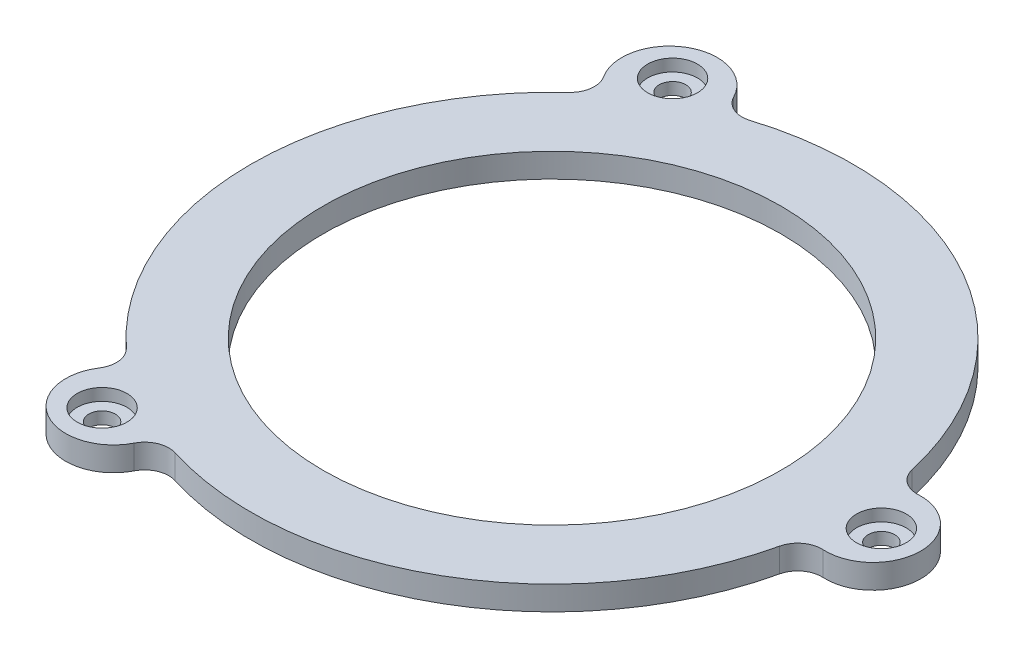
ISO-10303-21;
HEADER;
FILE_DESCRIPTION(('STEP AP214'),'2;1');
FILE_NAME('part.step','',(''),(''),'','','');
FILE_SCHEMA(('AUTOMOTIVE_DESIGN { 1 0 10303 214 1 1 1 1 }'));
ENDSEC;
DATA;
#1=APPLICATION_CONTEXT('core data for automotive mechanical design processes');
#2=APPLICATION_PROTOCOL_DEFINITION('international standard','automotive_design',2000,#1);
#3=PRODUCT_CONTEXT('',#1,'mechanical');
#4=PRODUCT('Part','Part','',(#3));
#5=PRODUCT_RELATED_PRODUCT_CATEGORY('part','',(#4));
#6=PRODUCT_DEFINITION_FORMATION('','',#4);
#7=PRODUCT_DEFINITION_CONTEXT('part definition',#1,'design');
#8=PRODUCT_DEFINITION('design','',#6,#7);
#9=PRODUCT_DEFINITION_SHAPE('','',#8);
#10=(LENGTH_UNIT() NAMED_UNIT(*) SI_UNIT(.MILLI.,.METRE.));
#11=(NAMED_UNIT(*) PLANE_ANGLE_UNIT() SI_UNIT($,.RADIAN.));
#12=(NAMED_UNIT(*) SI_UNIT($,.STERADIAN.) SOLID_ANGLE_UNIT());
#13=UNCERTAINTY_MEASURE_WITH_UNIT(LENGTH_MEASURE(1.E-05),#10,'distance_accuracy_value','');
#14=(GEOMETRIC_REPRESENTATION_CONTEXT(3) GLOBAL_UNCERTAINTY_ASSIGNED_CONTEXT((#13)) GLOBAL_UNIT_ASSIGNED_CONTEXT((#10,
#11,#12)) REPRESENTATION_CONTEXT('',''));
#15=CARTESIAN_POINT('',(0.,0.,0.));
#16=DIRECTION('',(0.,0.,1.));
#17=DIRECTION('',(1.,0.,0.));
#18=AXIS2_PLACEMENT_3D('',#15,#16,#17);
#19=CARTESIAN_POINT('',(-20.5,-7.,-35.507041555162));
#20=DIRECTION('',(0.,1.,0.));
#21=DIRECTION('',(0.,0.,1.));
#22=AXIS2_PLACEMENT_3D('',#19,#20,#21);
#23=CYLINDRICAL_SURFACE('',#22,1.64999999999999);
#24=CARTESIAN_POINT('',(-20.5,0.,-35.507041555162));
#25=DIRECTION('',(0.,1.,0.));
#26=DIRECTION('',(0.,0.,1.));
#27=AXIS2_PLACEMENT_3D('',#24,#25,#26);
#28=CIRCLE('',#27,1.64999999999999);
#29=CARTESIAN_POINT('',(-20.5,0.,-33.857041555162));
#30=VERTEX_POINT('',#29);
#31=EDGE_CURVE('E285',#30,#30,#28,.T.);
#32=ORIENTED_EDGE('',*,*,#31,.F.);
#33=EDGE_LOOP('',(#32));
#34=FACE_BOUND('',#33,.T.);
#35=CARTESIAN_POINT('',(-20.5,1.5,-35.507041555162));
#36=DIRECTION('',(0.,1.,0.));
#37=DIRECTION('',(0.,0.,1.));
#38=AXIS2_PLACEMENT_3D('',#35,#36,#37);
#39=CIRCLE('',#38,1.64999999999999);
#40=CARTESIAN_POINT('',(-20.5,1.5,-33.857041555162));
#41=VERTEX_POINT('',#40);
#42=EDGE_CURVE('E152',#41,#41,#39,.F.);
#43=ORIENTED_EDGE('',*,*,#42,.F.);
#44=EDGE_LOOP('',(#43));
#45=FACE_BOUND('',#44,.T.);
#46=ADVANCED_FACE('F32',(#34,#45),#23,.F.);
#47=CARTESIAN_POINT('',(-20.5,-7.,35.507041555162));
#48=DIRECTION('',(0.,1.,0.));
#49=DIRECTION('',(0.,0.,1.));
#50=AXIS2_PLACEMENT_3D('',#47,#48,#49);
#51=CYLINDRICAL_SURFACE('',#50,1.64999999999999);
#52=CARTESIAN_POINT('',(-20.5,0.,35.507041555162));
#53=DIRECTION('',(0.,1.,0.));
#54=DIRECTION('',(0.,0.,1.));
#55=AXIS2_PLACEMENT_3D('',#52,#53,#54);
#56=CIRCLE('',#55,1.64999999999999);
#57=CARTESIAN_POINT('',(-20.5,0.,37.157041555162));
#58=VERTEX_POINT('',#57);
#59=EDGE_CURVE('E288',#58,#58,#56,.T.);
#60=ORIENTED_EDGE('',*,*,#59,.F.);
#61=EDGE_LOOP('',(#60));
#62=FACE_BOUND('',#61,.T.);
#63=CARTESIAN_POINT('',(-20.5,1.5,35.507041555162));
#64=DIRECTION('',(0.,1.,0.));
#65=DIRECTION('',(0.,0.,1.));
#66=AXIS2_PLACEMENT_3D('',#63,#64,#65);
#67=CIRCLE('',#66,1.64999999999999);
#68=CARTESIAN_POINT('',(-20.5,1.5,37.157041555162));
#69=VERTEX_POINT('',#68);
#70=EDGE_CURVE('E297',#69,#69,#67,.F.);
#71=ORIENTED_EDGE('',*,*,#70,.F.);
#72=EDGE_LOOP('',(#71));
#73=FACE_BOUND('',#72,.T.);
#74=ADVANCED_FACE('F219',(#62,#73),#51,.F.);
#75=CARTESIAN_POINT('',(41.,-7.,0.));
#76=DIRECTION('',(0.,1.,0.));
#77=DIRECTION('',(0.,0.,1.));
#78=AXIS2_PLACEMENT_3D('',#75,#76,#77);
#79=CYLINDRICAL_SURFACE('',#78,1.65);
#80=CARTESIAN_POINT('',(41.,0.,0.));
#81=DIRECTION('',(0.,1.,0.));
#82=DIRECTION('',(0.,0.,1.));
#83=AXIS2_PLACEMENT_3D('',#80,#81,#82);
#84=CIRCLE('',#83,1.65);
#85=CARTESIAN_POINT('',(41.,0.,1.65));
#86=VERTEX_POINT('',#85);
#87=EDGE_CURVE('E291',#86,#86,#84,.T.);
#88=ORIENTED_EDGE('',*,*,#87,.F.);
#89=EDGE_LOOP('',(#88));
#90=FACE_BOUND('',#89,.T.);
#91=CARTESIAN_POINT('',(41.,1.5,0.));
#92=DIRECTION('',(0.,1.,0.));
#93=DIRECTION('',(0.,0.,1.));
#94=AXIS2_PLACEMENT_3D('',#91,#92,#93);
#95=CIRCLE('',#94,1.65);
#96=CARTESIAN_POINT('',(41.,1.5,1.65));
#97=VERTEX_POINT('',#96);
#98=EDGE_CURVE('E295',#97,#97,#95,.F.);
#99=ORIENTED_EDGE('',*,*,#98,.F.);
#100=EDGE_LOOP('',(#99));
#101=FACE_BOUND('',#100,.T.);
#102=ADVANCED_FACE('F225',(#90,#101),#79,.F.);
#103=CARTESIAN_POINT('',(0.,3.,0.));
#104=DIRECTION('',(0.,-1.,0.));
#105=DIRECTION('',(0.,0.,-1.));
#106=AXIS2_PLACEMENT_3D('',#103,#104,#105);
#107=CYLINDRICAL_SURFACE('',#106,37.5);
#108=CARTESIAN_POINT('',(0.,0.,0.));
#109=DIRECTION('',(0.,1.,0.));
#110=DIRECTION('',(0.,0.,1.));
#111=AXIS2_PLACEMENT_3D('',#108,#109,#110);
#112=CIRCLE('',#111,37.5);
#113=CARTESIAN_POINT('',(36.578160438466,0.,-8.26366619230459));
#114=VERTEX_POINT('',#113);
#115=CARTESIAN_POINT('',(-11.1325353683026,0.,-35.8094492595668));
#116=VERTEX_POINT('',#115);
#117=EDGE_CURVE('E143',#114,#116,#112,.T.);
#118=ORIENTED_EDGE('',*,*,#117,.T.);
#119=DIRECTION('',(0.,-1.,0.));
#120=VECTOR('',#119,1.);
#121=CARTESIAN_POINT('',(-11.1325353683026,3.,-35.8094492595668));
#122=LINE('',#121,#120);
#123=CARTESIAN_POINT('',(-11.1325353683026,3.,-35.8094492595668));
#124=VERTEX_POINT('',#123);
#125=EDGE_CURVE('E175',#116,#124,#122,.F.);
#126=ORIENTED_EDGE('',*,*,#125,.T.);
#127=CARTESIAN_POINT('',(0.,3.,0.));
#128=DIRECTION('',(0.,1.,0.));
#129=DIRECTION('',(0.,0.,1.));
#130=AXIS2_PLACEMENT_3D('',#127,#128,#129);
#131=CIRCLE('',#130,37.5);
#132=CARTESIAN_POINT('',(36.578160438466,3.,-8.26366619230459));
#133=VERTEX_POINT('',#132);
#134=EDGE_CURVE('E145',#133,#124,#131,.T.);
#135=ORIENTED_EDGE('',*,*,#134,.F.);
#136=DIRECTION('',(0.,-1.,0.));
#137=VECTOR('',#136,1.);
#138=CARTESIAN_POINT('',(36.578160438466,3.,-8.26366619230459));
#139=LINE('',#138,#137);
#140=EDGE_CURVE('E173',#133,#114,#139,.T.);
#141=ORIENTED_EDGE('',*,*,#140,.T.);
#142=EDGE_LOOP('',(#118,#126,#135,#141));
#143=FACE_BOUND('',#142,.T.);
#144=ADVANCED_FACE('F202',(#143),#107,.T.);
#145=CARTESIAN_POINT('',(-25.4456250701634,0.,-27.5457830672622));
#146=VERTEX_POINT('',#145);
#147=CARTESIAN_POINT('',(-25.4456250701634,0.,27.5457830672623));
#148=VERTEX_POINT('',#147);
#149=EDGE_CURVE('E204',#146,#148,#112,.T.);
#150=ORIENTED_EDGE('',*,*,#149,.T.);
#151=DIRECTION('',(0.,-1.,0.));
#152=VECTOR('',#151,1.);
#153=CARTESIAN_POINT('',(-25.4456250701634,3.,27.5457830672623));
#154=LINE('',#153,#152);
#155=CARTESIAN_POINT('',(-25.4456250701634,3.,27.5457830672623));
#156=VERTEX_POINT('',#155);
#157=EDGE_CURVE('E165',#148,#156,#154,.F.);
#158=ORIENTED_EDGE('',*,*,#157,.T.);
#159=CARTESIAN_POINT('',(-25.4456250701634,3.,-27.5457830672622));
#160=VERTEX_POINT('',#159);
#161=EDGE_CURVE('E142',#160,#156,#131,.T.);
#162=ORIENTED_EDGE('',*,*,#161,.F.);
#163=DIRECTION('',(0.,-1.,0.));
#164=VECTOR('',#163,1.);
#165=CARTESIAN_POINT('',(-25.4456250701634,3.,-27.5457830672622));
#166=LINE('',#165,#164);
#167=EDGE_CURVE('E163',#160,#146,#166,.T.);
#168=ORIENTED_EDGE('',*,*,#167,.T.);
#169=EDGE_LOOP('',(#150,#158,#162,#168));
#170=FACE_BOUND('',#169,.T.);
#171=ADVANCED_FACE('F251',(#170),#107,.T.);
#172=CARTESIAN_POINT('',(0.,3.,0.));
#173=DIRECTION('',(0.,1.,0.));
#174=DIRECTION('',(0.,0.,1.));
#175=AXIS2_PLACEMENT_3D('',#172,#173,#174);
#176=PLANE('',#175);
#177=CARTESIAN_POINT('',(41.,3.,0.));
#178=DIRECTION('',(0.,1.,0.));
#179=DIRECTION('',(0.,0.,1.));
#180=AXIS2_PLACEMENT_3D('',#177,#178,#179);
#181=CIRCLE('',#180,3.1);
#182=CARTESIAN_POINT('',(41.,3.,3.1));
#183=VERTEX_POINT('',#182);
#184=EDGE_CURVE('E351',#183,#183,#181,.T.);
#185=ORIENTED_EDGE('',*,*,#184,.F.);
#186=EDGE_LOOP('',(#185));
#187=FACE_BOUND('',#186,.T.);
#188=CARTESIAN_POINT('',(-20.5000000000002,3.,35.5070415551619));
#189=DIRECTION('',(0.,1.,0.));
#190=DIRECTION('',(0.,0.,1.));
#191=AXIS2_PLACEMENT_3D('',#188,#189,#190);
#192=CIRCLE('',#191,3.1);
#193=CARTESIAN_POINT('',(-20.5000000000002,3.,38.6070415551619));
#194=VERTEX_POINT('',#193);
#195=EDGE_CURVE('E347',#194,#194,#192,.T.);
#196=ORIENTED_EDGE('',*,*,#195,.F.);
#197=EDGE_LOOP('',(#196));
#198=FACE_BOUND('',#197,.T.);
#199=CARTESIAN_POINT('',(-20.4999999999997,3.,-35.5070415551622));
#200=DIRECTION('',(0.,1.,0.));
#201=DIRECTION('',(0.,0.,1.));
#202=AXIS2_PLACEMENT_3D('',#199,#200,#201);
#203=CIRCLE('',#202,3.09999999999999);
#204=CARTESIAN_POINT('',(-20.4999999999997,3.,-32.4070415551622));
#205=VERTEX_POINT('',#204);
#206=EDGE_CURVE('E348',#205,#205,#203,.T.);
#207=ORIENTED_EDGE('',*,*,#206,.F.);
#208=EDGE_LOOP('',(#207));
#209=FACE_BOUND('',#208,.T.);
#210=CARTESIAN_POINT('',(39.9644414467761,3.,0.));
#211=DIRECTION('',(0.,1.,0.));
#212=DIRECTION('',(0.,0.,-1.));
#213=AXIS2_PLACEMENT_3D('',#210,#211,#212);
#214=CIRCLE('',#213,5.93660773634279);
#215=CARTESIAN_POINT('',(39.6588437420628,3.,5.92873691928382));
#216=VERTEX_POINT('',#215);
#217=CARTESIAN_POINT('',(39.6588437420628,3.,-5.92873691928383));
#218=VERTEX_POINT('',#217);
#219=EDGE_CURVE('E363',#216,#218,#214,.T.);
#220=ORIENTED_EDGE('',*,*,#219,.T.);
#221=CARTESIAN_POINT('',(39.5044132735433,3.,-8.92475948768896));
#222=DIRECTION('',(0.,1.,0.));
#223=DIRECTION('',(0.,0.,1.));
#224=AXIS2_PLACEMENT_3D('',#221,#222,#223);
#225=CIRCLE('',#224,3.);
#226=EDGE_CURVE('E40',#218,#133,#225,.F.);
#227=ORIENTED_EDGE('',*,*,#226,.T.);
#228=ORIENTED_EDGE('',*,*,#134,.T.);
#229=CARTESIAN_POINT('',(-12.0231381977668,3.,-38.6742052003322));
#230=DIRECTION('',(0.,1.,0.));
#231=DIRECTION('',(0.,0.,1.));
#232=AXIS2_PLACEMENT_3D('',#229,#230,#231);
#233=CIRCLE('',#232,3.);
#234=CARTESIAN_POINT('',(-14.6949850865769,3.,-37.3099346249858));
#235=VERTEX_POINT('',#234);
#236=EDGE_CURVE('E47',#124,#235,#233,.F.);
#237=ORIENTED_EDGE('',*,*,#236,.T.);
#238=CARTESIAN_POINT('',(-19.982220723388,3.,-34.6102215409638));
#239=DIRECTION('',(0.,1.,0.));
#240=DIRECTION('',(0.,0.,-1.));
#241=AXIS2_PLACEMENT_3D('',#238,#239,#240);
#242=CIRCLE('',#241,5.93660773634279);
#243=CARTESIAN_POINT('',(-24.9638586554859,3.,-31.381197705702));
#244=VERTEX_POINT('',#243);
#245=EDGE_CURVE('E294',#235,#244,#242,.T.);
#246=ORIENTED_EDGE('',*,*,#245,.T.);
#247=CARTESIAN_POINT('',(-27.4812750757765,3.,-29.7494457126432));
#248=DIRECTION('',(0.,1.,0.));
#249=DIRECTION('',(0.,0.,1.));
#250=AXIS2_PLACEMENT_3D('',#247,#248,#249);
#251=CIRCLE('',#250,3.);
#252=EDGE_CURVE('E185',#244,#160,#251,.F.);
#253=ORIENTED_EDGE('',*,*,#252,.T.);
#254=ORIENTED_EDGE('',*,*,#161,.T.);
#255=CARTESIAN_POINT('',(-27.4812750757765,3.,29.7494457126432));
#256=DIRECTION('',(0.,1.,0.));
#257=DIRECTION('',(0.,0.,1.));
#258=AXIS2_PLACEMENT_3D('',#255,#256,#257);
#259=CIRCLE('',#258,3.);
#260=CARTESIAN_POINT('',(-24.9638586554859,3.,31.381197705702));
#261=VERTEX_POINT('',#260);
#262=EDGE_CURVE('E181',#156,#261,#259,.F.);
#263=ORIENTED_EDGE('',*,*,#262,.T.);
#264=CARTESIAN_POINT('',(-19.982220723388,3.,34.6102215409638));
#265=DIRECTION('',(0.,1.,0.));
#266=DIRECTION('',(0.,0.,-1.));
#267=AXIS2_PLACEMENT_3D('',#264,#265,#266);
#268=CIRCLE('',#267,5.93660773634279);
#269=CARTESIAN_POINT('',(-14.6949850865769,3.,37.3099346249858));
#270=VERTEX_POINT('',#269);
#271=EDGE_CURVE('E126',#261,#270,#268,.T.);
#272=ORIENTED_EDGE('',*,*,#271,.T.);
#273=CARTESIAN_POINT('',(-12.0231381977668,3.,38.6742052003322));
#274=DIRECTION('',(0.,1.,0.));
#275=DIRECTION('',(0.,0.,1.));
#276=AXIS2_PLACEMENT_3D('',#273,#274,#275);
#277=CIRCLE('',#276,3.);
#278=CARTESIAN_POINT('',(-11.1325353683026,3.,35.8094492595668));
#279=VERTEX_POINT('',#278);
#280=EDGE_CURVE('E120',#270,#279,#277,.F.);
#281=ORIENTED_EDGE('',*,*,#280,.T.);
#282=CARTESIAN_POINT('',(36.578160438466,3.,8.2636661923046));
#283=VERTEX_POINT('',#282);
#284=EDGE_CURVE('E124',#279,#283,#131,.T.);
#285=ORIENTED_EDGE('',*,*,#284,.T.);
#286=CARTESIAN_POINT('',(39.5044132735433,3.,8.92475948768896));
#287=DIRECTION('',(0.,1.,0.));
#288=DIRECTION('',(0.,0.,1.));
#289=AXIS2_PLACEMENT_3D('',#286,#287,#288);
#290=CIRCLE('',#289,3.);
#291=EDGE_CURVE('E177',#283,#216,#290,.F.);
#292=ORIENTED_EDGE('',*,*,#291,.T.);
#293=EDGE_LOOP('',(#220,#227,#228,#237,#246,#253,#254,#263,#272,#281,#285,#292));
#294=FACE_BOUND('',#293,.T.);
#295=CARTESIAN_POINT('',(0.,3.,0.));
#296=DIRECTION('',(0.,1.,0.));
#297=DIRECTION('',(0.,0.,1.));
#298=AXIS2_PLACEMENT_3D('',#295,#296,#297);
#299=CIRCLE('',#298,28.5);
#300=CARTESIAN_POINT('',(0.,3.,28.5));
#301=VERTEX_POINT('',#300);
#302=EDGE_CURVE('E282',#301,#301,#299,.T.);
#303=ORIENTED_EDGE('',*,*,#302,.F.);
#304=EDGE_LOOP('',(#303));
#305=FACE_BOUND('',#304,.T.);
#306=ADVANCED_FACE('F122',(#187,#198,#209,#294,#305),#176,.T.);
#307=CARTESIAN_POINT('',(0.,0.,0.));
#308=DIRECTION('',(0.,1.,0.));
#309=DIRECTION('',(0.,0.,1.));
#310=AXIS2_PLACEMENT_3D('',#307,#308,#309);
#311=PLANE('',#310);
#312=ORIENTED_EDGE('',*,*,#87,.T.);
#313=EDGE_LOOP('',(#312));
#314=FACE_BOUND('',#313,.T.);
#315=ORIENTED_EDGE('',*,*,#59,.T.);
#316=EDGE_LOOP('',(#315));
#317=FACE_BOUND('',#316,.T.);
#318=ORIENTED_EDGE('',*,*,#31,.T.);
#319=EDGE_LOOP('',(#318));
#320=FACE_BOUND('',#319,.T.);
#321=ORIENTED_EDGE('',*,*,#117,.F.);
#322=CARTESIAN_POINT('',(39.5044132735433,0.,-8.92475948768896));
#323=DIRECTION('',(0.,1.,0.));
#324=DIRECTION('',(0.,0.,1.));
#325=AXIS2_PLACEMENT_3D('',#322,#323,#324);
#326=CIRCLE('',#325,3.);
#327=CARTESIAN_POINT('',(39.6588437420628,0.,-5.92873691928383));
#328=VERTEX_POINT('',#327);
#329=EDGE_CURVE('E11',#114,#328,#326,.T.);
#330=ORIENTED_EDGE('',*,*,#329,.T.);
#331=CARTESIAN_POINT('',(39.9644414467761,0.,0.));
#332=DIRECTION('',(0.,1.,0.));
#333=DIRECTION('',(0.,0.,-1.));
#334=AXIS2_PLACEMENT_3D('',#331,#332,#333);
#335=CIRCLE('',#334,5.93660773634279);
#336=CARTESIAN_POINT('',(39.6588437420628,0.,5.92873691928382));
#337=VERTEX_POINT('',#336);
#338=EDGE_CURVE('E365',#337,#328,#335,.T.);
#339=ORIENTED_EDGE('',*,*,#338,.F.);
#340=CARTESIAN_POINT('',(39.5044132735433,0.,8.92475948768896));
#341=DIRECTION('',(0.,1.,0.));
#342=DIRECTION('',(0.,0.,1.));
#343=AXIS2_PLACEMENT_3D('',#340,#341,#342);
#344=CIRCLE('',#343,3.);
#345=CARTESIAN_POINT('',(36.578160438466,0.,8.2636661923046));
#346=VERTEX_POINT('',#345);
#347=EDGE_CURVE('E132',#337,#346,#344,.T.);
#348=ORIENTED_EDGE('',*,*,#347,.T.);
#349=CARTESIAN_POINT('',(-11.1325353683026,0.,35.8094492595668));
#350=VERTEX_POINT('',#349);
#351=EDGE_CURVE('E206',#350,#346,#112,.T.);
#352=ORIENTED_EDGE('',*,*,#351,.F.);
#353=CARTESIAN_POINT('',(-12.0231381977668,0.,38.6742052003322));
#354=DIRECTION('',(0.,1.,0.));
#355=DIRECTION('',(0.,0.,1.));
#356=AXIS2_PLACEMENT_3D('',#353,#354,#355);
#357=CIRCLE('',#356,3.);
#358=CARTESIAN_POINT('',(-14.6949850865769,0.,37.3099346249858));
#359=VERTEX_POINT('',#358);
#360=EDGE_CURVE('E131',#350,#359,#357,.T.);
#361=ORIENTED_EDGE('',*,*,#360,.T.);
#362=CARTESIAN_POINT('',(-19.982220723388,0.,34.6102215409638));
#363=DIRECTION('',(0.,1.,0.));
#364=DIRECTION('',(0.,0.,-1.));
#365=AXIS2_PLACEMENT_3D('',#362,#363,#364);
#366=CIRCLE('',#365,5.93660773634279);
#367=CARTESIAN_POINT('',(-24.9638586554859,0.,31.381197705702));
#368=VERTEX_POINT('',#367);
#369=EDGE_CURVE('E277',#368,#359,#366,.T.);
#370=ORIENTED_EDGE('',*,*,#369,.F.);
#371=CARTESIAN_POINT('',(-27.4812750757765,0.,29.7494457126432));
#372=DIRECTION('',(0.,1.,0.));
#373=DIRECTION('',(0.,0.,1.));
#374=AXIS2_PLACEMENT_3D('',#371,#372,#373);
#375=CIRCLE('',#374,3.);
#376=EDGE_CURVE('E183',#368,#148,#375,.T.);
#377=ORIENTED_EDGE('',*,*,#376,.T.);
#378=ORIENTED_EDGE('',*,*,#149,.F.);
#379=CARTESIAN_POINT('',(-27.4812750757765,0.,-29.7494457126432));
#380=DIRECTION('',(0.,1.,0.));
#381=DIRECTION('',(0.,0.,1.));
#382=AXIS2_PLACEMENT_3D('',#379,#380,#381);
#383=CIRCLE('',#382,3.);
#384=CARTESIAN_POINT('',(-24.9638586554859,0.,-31.381197705702));
#385=VERTEX_POINT('',#384);
#386=EDGE_CURVE('E187',#146,#385,#383,.T.);
#387=ORIENTED_EDGE('',*,*,#386,.T.);
#388=CARTESIAN_POINT('',(-19.982220723388,0.,-34.6102215409638));
#389=DIRECTION('',(0.,1.,0.));
#390=DIRECTION('',(0.,0.,-1.));
#391=AXIS2_PLACEMENT_3D('',#388,#389,#390);
#392=CIRCLE('',#391,5.93660773634279);
#393=CARTESIAN_POINT('',(-14.6949850865769,0.,-37.3099346249858));
#394=VERTEX_POINT('',#393);
#395=EDGE_CURVE('E200',#394,#385,#392,.T.);
#396=ORIENTED_EDGE('',*,*,#395,.F.);
#397=CARTESIAN_POINT('',(-12.0231381977668,0.,-38.6742052003322));
#398=DIRECTION('',(0.,1.,0.));
#399=DIRECTION('',(0.,0.,1.));
#400=AXIS2_PLACEMENT_3D('',#397,#398,#399);
#401=CIRCLE('',#400,3.);
#402=EDGE_CURVE('E190',#394,#116,#401,.T.);
#403=ORIENTED_EDGE('',*,*,#402,.T.);
#404=EDGE_LOOP('',(#321,#330,#339,#348,#352,#361,#370,#377,#378,#387,#396,#403));
#405=FACE_BOUND('',#404,.T.);
#406=CARTESIAN_POINT('',(0.,0.,0.));
#407=DIRECTION('',(0.,1.,0.));
#408=DIRECTION('',(0.,0.,1.));
#409=AXIS2_PLACEMENT_3D('',#406,#407,#408);
#410=CIRCLE('',#409,28.5);
#411=CARTESIAN_POINT('',(0.,0.,28.5));
#412=VERTEX_POINT('',#411);
#413=EDGE_CURVE('E368',#412,#412,#410,.T.);
#414=ORIENTED_EDGE('',*,*,#413,.T.);
#415=EDGE_LOOP('',(#414));
#416=FACE_BOUND('',#415,.T.);
#417=ADVANCED_FACE('F196',(#314,#317,#320,#405,#416),#311,.F.);
#418=ORIENTED_EDGE('',*,*,#351,.T.);
#419=DIRECTION('',(0.,-1.,0.));
#420=VECTOR('',#419,1.);
#421=CARTESIAN_POINT('',(36.578160438466,3.,8.2636661923046));
#422=LINE('',#421,#420);
#423=EDGE_CURVE('E141',#346,#283,#422,.F.);
#424=ORIENTED_EDGE('',*,*,#423,.T.);
#425=ORIENTED_EDGE('',*,*,#284,.F.);
#426=DIRECTION('',(0.,-1.,0.));
#427=VECTOR('',#426,1.);
#428=CARTESIAN_POINT('',(-11.1325353683026,3.,35.8094492595668));
#429=LINE('',#428,#427);
#430=EDGE_CURVE('E138',#279,#350,#429,.T.);
#431=ORIENTED_EDGE('',*,*,#430,.T.);
#432=EDGE_LOOP('',(#418,#424,#425,#431));
#433=FACE_BOUND('',#432,.T.);
#434=ADVANCED_FACE('F137',(#433),#107,.T.);
#435=CARTESIAN_POINT('',(0.,3.,0.));
#436=DIRECTION('',(0.,-1.,0.));
#437=DIRECTION('',(0.,0.,-1.));
#438=AXIS2_PLACEMENT_3D('',#435,#436,#437);
#439=CYLINDRICAL_SURFACE('',#438,28.5);
#440=ORIENTED_EDGE('',*,*,#302,.T.);
#441=EDGE_LOOP('',(#440));
#442=FACE_BOUND('',#441,.T.);
#443=ORIENTED_EDGE('',*,*,#413,.F.);
#444=EDGE_LOOP('',(#443));
#445=FACE_BOUND('',#444,.T.);
#446=ADVANCED_FACE('F244',(#442,#445),#439,.F.);
#447=CARTESIAN_POINT('',(39.9644414467761,0.,0.));
#448=DIRECTION('',(0.,1.,0.));
#449=DIRECTION('',(0.,0.,1.));
#450=AXIS2_PLACEMENT_3D('',#447,#448,#449);
#451=CYLINDRICAL_SURFACE('',#450,5.93660773634279);
#452=ORIENTED_EDGE('',*,*,#219,.F.);
#453=DIRECTION('',(0.,1.,0.));
#454=VECTOR('',#453,1.);
#455=CARTESIAN_POINT('',(39.6588437420628,0.,5.92873691928382));
#456=LINE('',#455,#454);
#457=EDGE_CURVE('E157',#216,#337,#456,.F.);
#458=ORIENTED_EDGE('',*,*,#457,.T.);
#459=ORIENTED_EDGE('',*,*,#338,.T.);
#460=DIRECTION('',(0.,1.,0.));
#461=VECTOR('',#460,1.);
#462=CARTESIAN_POINT('',(39.6588437420628,0.,-5.92873691928383));
#463=LINE('',#462,#461);
#464=EDGE_CURVE('E149',#328,#218,#463,.T.);
#465=ORIENTED_EDGE('',*,*,#464,.T.);
#466=EDGE_LOOP('',(#452,#458,#459,#465));
#467=FACE_BOUND('',#466,.T.);
#468=ADVANCED_FACE('F240',(#467),#451,.T.);
#469=CARTESIAN_POINT('',(-19.982220723388,0.,34.6102215409638));
#470=DIRECTION('',(0.,1.,0.));
#471=DIRECTION('',(0.,0.,1.));
#472=AXIS2_PLACEMENT_3D('',#469,#470,#471);
#473=CYLINDRICAL_SURFACE('',#472,5.93660773634279);
#474=ORIENTED_EDGE('',*,*,#369,.T.);
#475=DIRECTION('',(0.,1.,0.));
#476=VECTOR('',#475,1.);
#477=CARTESIAN_POINT('',(-14.6949850865769,0.,37.3099346249858));
#478=LINE('',#477,#476);
#479=EDGE_CURVE('E161',#359,#270,#478,.T.);
#480=ORIENTED_EDGE('',*,*,#479,.T.);
#481=ORIENTED_EDGE('',*,*,#271,.F.);
#482=DIRECTION('',(0.,1.,0.));
#483=VECTOR('',#482,1.);
#484=CARTESIAN_POINT('',(-24.9638586554859,0.,31.381197705702));
#485=LINE('',#484,#483);
#486=EDGE_CURVE('E159',#261,#368,#485,.F.);
#487=ORIENTED_EDGE('',*,*,#486,.T.);
#488=EDGE_LOOP('',(#474,#480,#481,#487));
#489=FACE_BOUND('',#488,.T.);
#490=ADVANCED_FACE('F236',(#489),#473,.T.);
#491=CARTESIAN_POINT('',(-19.982220723388,0.,-34.6102215409638));
#492=DIRECTION('',(0.,1.,0.));
#493=DIRECTION('',(0.,0.,1.));
#494=AXIS2_PLACEMENT_3D('',#491,#492,#493);
#495=CYLINDRICAL_SURFACE('',#494,5.93660773634279);
#496=ORIENTED_EDGE('',*,*,#395,.T.);
#497=DIRECTION('',(0.,1.,0.));
#498=VECTOR('',#497,1.);
#499=CARTESIAN_POINT('',(-24.9638586554859,0.,-31.381197705702));
#500=LINE('',#499,#498);
#501=EDGE_CURVE('E170',#385,#244,#500,.T.);
#502=ORIENTED_EDGE('',*,*,#501,.T.);
#503=ORIENTED_EDGE('',*,*,#245,.F.);
#504=DIRECTION('',(0.,1.,0.));
#505=VECTOR('',#504,1.);
#506=CARTESIAN_POINT('',(-14.6949850865769,0.,-37.3099346249858));
#507=LINE('',#506,#505);
#508=EDGE_CURVE('E168',#235,#394,#507,.F.);
#509=ORIENTED_EDGE('',*,*,#508,.T.);
#510=EDGE_LOOP('',(#496,#502,#503,#509));
#511=FACE_BOUND('',#510,.T.);
#512=ADVANCED_FACE('F232',(#511),#495,.T.);
#513=CARTESIAN_POINT('',(41.,1.5,0.));
#514=DIRECTION('',(0.,1.,0.));
#515=DIRECTION('',(0.,0.,1.));
#516=AXIS2_PLACEMENT_3D('',#513,#514,#515);
#517=PLANE('',#516);
#518=CARTESIAN_POINT('',(41.,1.5,0.));
#519=DIRECTION('',(0.,1.,0.));
#520=DIRECTION('',(0.,0.,1.));
#521=AXIS2_PLACEMENT_3D('',#518,#519,#520);
#522=CIRCLE('',#521,3.1);
#523=CARTESIAN_POINT('',(41.,1.5,3.1));
#524=VERTEX_POINT('',#523);
#525=EDGE_CURVE('E298',#524,#524,#522,.T.);
#526=ORIENTED_EDGE('',*,*,#525,.T.);
#527=EDGE_LOOP('',(#526));
#528=FACE_BOUND('',#527,.T.);
#529=ORIENTED_EDGE('',*,*,#98,.T.);
#530=EDGE_LOOP('',(#529));
#531=FACE_BOUND('',#530,.T.);
#532=ADVANCED_FACE('F235',(#528,#531),#517,.T.);
#533=CARTESIAN_POINT('',(41.,1.5,0.));
#534=DIRECTION('',(0.,1.,0.));
#535=DIRECTION('',(0.,0.,1.));
#536=AXIS2_PLACEMENT_3D('',#533,#534,#535);
#537=CYLINDRICAL_SURFACE('',#536,3.1);
#538=ORIENTED_EDGE('',*,*,#525,.F.);
#539=EDGE_LOOP('',(#538));
#540=FACE_BOUND('',#539,.T.);
#541=ORIENTED_EDGE('',*,*,#184,.T.);
#542=EDGE_LOOP('',(#541));
#543=FACE_BOUND('',#542,.T.);
#544=ADVANCED_FACE('F331',(#540,#543),#537,.F.);
#545=CARTESIAN_POINT('',(-20.5000000000002,1.5,35.5070415551619));
#546=DIRECTION('',(0.,1.,0.));
#547=DIRECTION('',(0.,0.,1.));
#548=AXIS2_PLACEMENT_3D('',#545,#546,#547);
#549=PLANE('',#548);
#550=CARTESIAN_POINT('',(-20.5000000000002,1.5,35.5070415551619));
#551=DIRECTION('',(0.,1.,0.));
#552=DIRECTION('',(0.,0.,1.));
#553=AXIS2_PLACEMENT_3D('',#550,#551,#552);
#554=CIRCLE('',#553,3.1);
#555=CARTESIAN_POINT('',(-20.5000000000002,1.5,38.6070415551619));
#556=VERTEX_POINT('',#555);
#557=EDGE_CURVE('E346',#556,#556,#554,.T.);
#558=ORIENTED_EDGE('',*,*,#557,.T.);
#559=EDGE_LOOP('',(#558));
#560=FACE_BOUND('',#559,.T.);
#561=ORIENTED_EDGE('',*,*,#70,.T.);
#562=EDGE_LOOP('',(#561));
#563=FACE_BOUND('',#562,.T.);
#564=ADVANCED_FACE('F316',(#560,#563),#549,.T.);
#565=CARTESIAN_POINT('',(-20.5000000000002,1.5,35.5070415551619));
#566=DIRECTION('',(0.,1.,0.));
#567=DIRECTION('',(0.,0.,1.));
#568=AXIS2_PLACEMENT_3D('',#565,#566,#567);
#569=CYLINDRICAL_SURFACE('',#568,3.1);
#570=ORIENTED_EDGE('',*,*,#557,.F.);
#571=EDGE_LOOP('',(#570));
#572=FACE_BOUND('',#571,.T.);
#573=ORIENTED_EDGE('',*,*,#195,.T.);
#574=EDGE_LOOP('',(#573));
#575=FACE_BOUND('',#574,.T.);
#576=ADVANCED_FACE('F307',(#572,#575),#569,.F.);
#577=CARTESIAN_POINT('',(-20.4999999999997,1.5,-35.5070415551622));
#578=DIRECTION('',(0.,1.,0.));
#579=DIRECTION('',(0.,0.,1.));
#580=AXIS2_PLACEMENT_3D('',#577,#578,#579);
#581=PLANE('',#580);
#582=CARTESIAN_POINT('',(-20.4999999999997,1.5,-35.5070415551622));
#583=DIRECTION('',(0.,1.,0.));
#584=DIRECTION('',(0.,0.,1.));
#585=AXIS2_PLACEMENT_3D('',#582,#583,#584);
#586=CIRCLE('',#585,3.09999999999999);
#587=CARTESIAN_POINT('',(-20.4999999999997,1.5,-32.4070415551622));
#588=VERTEX_POINT('',#587);
#589=EDGE_CURVE('E354',#588,#588,#586,.T.);
#590=ORIENTED_EDGE('',*,*,#589,.T.);
#591=EDGE_LOOP('',(#590));
#592=FACE_BOUND('',#591,.T.);
#593=ORIENTED_EDGE('',*,*,#42,.T.);
#594=EDGE_LOOP('',(#593));
#595=FACE_BOUND('',#594,.T.);
#596=ADVANCED_FACE('F305',(#592,#595),#581,.T.);
#597=CARTESIAN_POINT('',(-20.4999999999997,1.5,-35.5070415551622));
#598=DIRECTION('',(0.,1.,0.));
#599=DIRECTION('',(0.,0.,1.));
#600=AXIS2_PLACEMENT_3D('',#597,#598,#599);
#601=CYLINDRICAL_SURFACE('',#600,3.09999999999999);
#602=ORIENTED_EDGE('',*,*,#589,.F.);
#603=EDGE_LOOP('',(#602));
#604=FACE_BOUND('',#603,.T.);
#605=ORIENTED_EDGE('',*,*,#206,.T.);
#606=EDGE_LOOP('',(#605));
#607=FACE_BOUND('',#606,.T.);
#608=ADVANCED_FACE('F261',(#604,#607),#601,.F.);
#609=CARTESIAN_POINT('',(39.5044132735433,0.,8.92475948768896));
#610=DIRECTION('',(0.,-1.,0.));
#611=DIRECTION('',(0.,0.,-1.));
#612=AXIS2_PLACEMENT_3D('',#609,#610,#611);
#613=CYLINDRICAL_SURFACE('',#612,3.);
#614=ORIENTED_EDGE('',*,*,#347,.F.);
#615=ORIENTED_EDGE('',*,*,#457,.F.);
#616=ORIENTED_EDGE('',*,*,#291,.F.);
#617=ORIENTED_EDGE('',*,*,#423,.F.);
#618=EDGE_LOOP('',(#614,#615,#616,#617));
#619=FACE_BOUND('',#618,.T.);
#620=ADVANCED_FACE('F258',(#619),#613,.F.);
#621=CARTESIAN_POINT('',(-12.0231381977668,3.,38.6742052003322));
#622=DIRECTION('',(0.,-1.,0.));
#623=DIRECTION('',(0.,0.,-1.));
#624=AXIS2_PLACEMENT_3D('',#621,#622,#623);
#625=CYLINDRICAL_SURFACE('',#624,3.);
#626=ORIENTED_EDGE('',*,*,#360,.F.);
#627=ORIENTED_EDGE('',*,*,#430,.F.);
#628=ORIENTED_EDGE('',*,*,#280,.F.);
#629=ORIENTED_EDGE('',*,*,#479,.F.);
#630=EDGE_LOOP('',(#626,#627,#628,#629));
#631=FACE_BOUND('',#630,.T.);
#632=ADVANCED_FACE('F147',(#631),#625,.F.);
#633=CARTESIAN_POINT('',(-27.4812750757765,0.,29.7494457126432));
#634=DIRECTION('',(0.,-1.,0.));
#635=DIRECTION('',(0.,0.,-1.));
#636=AXIS2_PLACEMENT_3D('',#633,#634,#635);
#637=CYLINDRICAL_SURFACE('',#636,3.);
#638=ORIENTED_EDGE('',*,*,#376,.F.);
#639=ORIENTED_EDGE('',*,*,#486,.F.);
#640=ORIENTED_EDGE('',*,*,#262,.F.);
#641=ORIENTED_EDGE('',*,*,#157,.F.);
#642=EDGE_LOOP('',(#638,#639,#640,#641));
#643=FACE_BOUND('',#642,.T.);
#644=ADVANCED_FACE('F215',(#643),#637,.F.);
#645=CARTESIAN_POINT('',(-27.4812750757765,3.,-29.7494457126432));
#646=DIRECTION('',(0.,-1.,0.));
#647=DIRECTION('',(0.,0.,-1.));
#648=AXIS2_PLACEMENT_3D('',#645,#646,#647);
#649=CYLINDRICAL_SURFACE('',#648,3.);
#650=ORIENTED_EDGE('',*,*,#386,.F.);
#651=ORIENTED_EDGE('',*,*,#167,.F.);
#652=ORIENTED_EDGE('',*,*,#252,.F.);
#653=ORIENTED_EDGE('',*,*,#501,.F.);
#654=EDGE_LOOP('',(#650,#651,#652,#653));
#655=FACE_BOUND('',#654,.T.);
#656=ADVANCED_FACE('F209',(#655),#649,.F.);
#657=CARTESIAN_POINT('',(-12.0231381977668,0.,-38.6742052003322));
#658=DIRECTION('',(0.,-1.,0.));
#659=DIRECTION('',(0.,0.,-1.));
#660=AXIS2_PLACEMENT_3D('',#657,#658,#659);
#661=CYLINDRICAL_SURFACE('',#660,3.);
#662=ORIENTED_EDGE('',*,*,#402,.F.);
#663=ORIENTED_EDGE('',*,*,#508,.F.);
#664=ORIENTED_EDGE('',*,*,#236,.F.);
#665=ORIENTED_EDGE('',*,*,#125,.F.);
#666=EDGE_LOOP('',(#662,#663,#664,#665));
#667=FACE_BOUND('',#666,.T.);
#668=ADVANCED_FACE('F207',(#667),#661,.F.);
#669=CARTESIAN_POINT('',(39.5044132735433,3.,-8.92475948768896));
#670=DIRECTION('',(0.,-1.,0.));
#671=DIRECTION('',(0.,0.,-1.));
#672=AXIS2_PLACEMENT_3D('',#669,#670,#671);
#673=CYLINDRICAL_SURFACE('',#672,3.);
#674=ORIENTED_EDGE('',*,*,#329,.F.);
#675=ORIENTED_EDGE('',*,*,#140,.F.);
#676=ORIENTED_EDGE('',*,*,#226,.F.);
#677=ORIENTED_EDGE('',*,*,#464,.F.);
#678=EDGE_LOOP('',(#674,#675,#676,#677));
#679=FACE_BOUND('',#678,.T.);
#680=ADVANCED_FACE('F34',(#679),#673,.F.);
#681=CLOSED_SHELL('',(#46,#74,#102,#144,#171,#306,#417,#434,#446,#468,#490,#512,#532,#544,#564,
#576,#596,#608,#620,#632,#644,#656,#668,#680));
#682=MANIFOLD_SOLID_BREP('B2',#681);
#683=ADVANCED_BREP_SHAPE_REPRESENTATION('',(#18,#682),#14);
#684=SHAPE_DEFINITION_REPRESENTATION(#9,#683);
ENDSEC;
END-ISO-10303-21;
